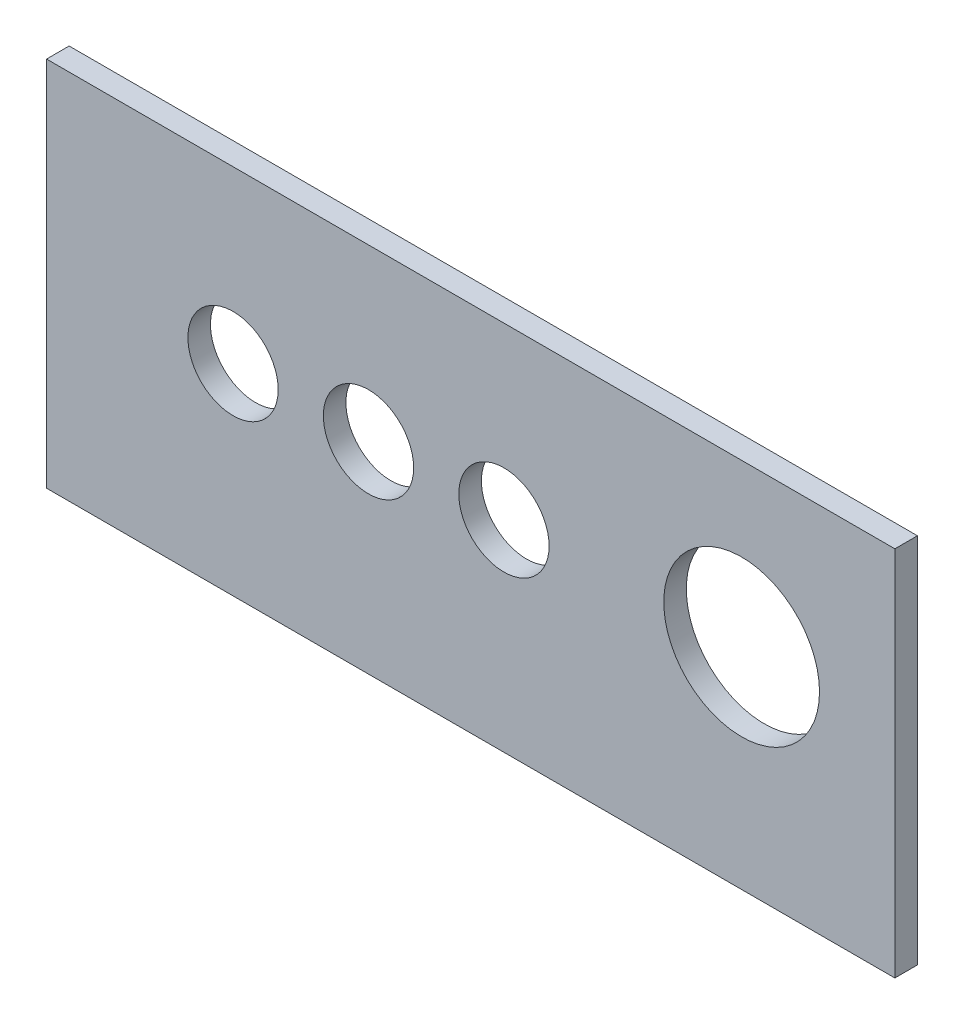
ISO-10303-21;
HEADER;
FILE_DESCRIPTION(('STEP AP214'),'2;1');
FILE_NAME('part.step','',(''),(''),'','','');
FILE_SCHEMA(('AUTOMOTIVE_DESIGN { 1 0 10303 214 1 1 1 1 }'));
ENDSEC;
DATA;
#1=APPLICATION_CONTEXT('core data for automotive mechanical design processes');
#2=APPLICATION_PROTOCOL_DEFINITION('international standard','automotive_design',2000,#1);
#3=PRODUCT_CONTEXT('',#1,'mechanical');
#4=PRODUCT('Part','Part','',(#3));
#5=PRODUCT_RELATED_PRODUCT_CATEGORY('part','',(#4));
#6=PRODUCT_DEFINITION_FORMATION('','',#4);
#7=PRODUCT_DEFINITION_CONTEXT('part definition',#1,'design');
#8=PRODUCT_DEFINITION('design','',#6,#7);
#9=PRODUCT_DEFINITION_SHAPE('','',#8);
#10=(LENGTH_UNIT() NAMED_UNIT(*) SI_UNIT(.MILLI.,.METRE.));
#11=(NAMED_UNIT(*) PLANE_ANGLE_UNIT() SI_UNIT($,.RADIAN.));
#12=(NAMED_UNIT(*) SI_UNIT($,.STERADIAN.) SOLID_ANGLE_UNIT());
#13=UNCERTAINTY_MEASURE_WITH_UNIT(LENGTH_MEASURE(1.E-05),#10,'distance_accuracy_value','');
#14=(GEOMETRIC_REPRESENTATION_CONTEXT(3) GLOBAL_UNCERTAINTY_ASSIGNED_CONTEXT((#13)) GLOBAL_UNIT_ASSIGNED_CONTEXT((#10,
#11,#12)) REPRESENTATION_CONTEXT('',''));
#15=CARTESIAN_POINT('',(0.,0.,0.));
#16=DIRECTION('',(0.,0.,1.));
#17=DIRECTION('',(1.,0.,0.));
#18=AXIS2_PLACEMENT_3D('',#15,#16,#17);
#19=CARTESIAN_POINT('',(0.,0.,12.7));
#20=DIRECTION('',(0.,0.,-1.));
#21=DIRECTION('',(-1.,0.,0.));
#22=AXIS2_PLACEMENT_3D('',#19,#20,#21);
#23=PLANE('',#22);
#24=DIRECTION('',(-1.,0.,0.));
#25=VECTOR('',#24,1.);
#26=CARTESIAN_POINT('',(7.20934195159046,216.99692709465,12.7));
#27=LINE('',#26,#25);
#28=CARTESIAN_POINT('',(484.398602740923,216.99692709465,12.7));
#29=VERTEX_POINT('',#28);
#30=CARTESIAN_POINT('',(7.20934195159046,216.99692709465,12.7));
#31=VERTEX_POINT('',#30);
#32=EDGE_CURVE('E84',#29,#31,#27,.T.);
#33=ORIENTED_EDGE('',*,*,#32,.T.);
#34=DIRECTION('',(0.,-1.,0.));
#35=VECTOR('',#34,1.);
#36=CARTESIAN_POINT('',(7.20934195159043,7.9019039756168,12.7));
#37=LINE('',#36,#35);
#38=CARTESIAN_POINT('',(7.20934195159043,7.9019039756168,12.7));
#39=VERTEX_POINT('',#38);
#40=EDGE_CURVE('E79',#31,#39,#37,.T.);
#41=ORIENTED_EDGE('',*,*,#40,.T.);
#42=DIRECTION('',(1.,0.,0.));
#43=VECTOR('',#42,1.);
#44=CARTESIAN_POINT('',(7.20934195159043,7.9019039756168,12.7));
#45=LINE('',#44,#43);
#46=CARTESIAN_POINT('',(484.398602740923,7.9019039756168,12.7));
#47=VERTEX_POINT('',#46);
#48=EDGE_CURVE('E82',#39,#47,#45,.T.);
#49=ORIENTED_EDGE('',*,*,#48,.T.);
#50=DIRECTION('',(0.,1.,0.));
#51=VECTOR('',#50,1.);
#52=CARTESIAN_POINT('',(484.398602740923,216.99692709465,12.7));
#53=LINE('',#52,#51);
#54=EDGE_CURVE('E49',#47,#29,#53,.T.);
#55=ORIENTED_EDGE('',*,*,#54,.T.);
#56=EDGE_LOOP('',(#33,#41,#49,#55));
#57=FACE_BOUND('',#56,.T.);
#58=CARTESIAN_POINT('',(264.498491904483,121.096908294048,12.7));
#59=DIRECTION('',(0.,0.,1.));
#60=DIRECTION('',(1.,0.,0.));
#61=AXIS2_PLACEMENT_3D('',#58,#59,#60);
#62=CIRCLE('',#61,25.3999999999999);
#63=CARTESIAN_POINT('',(289.898491904483,121.096908294048,12.7));
#64=VERTEX_POINT('',#63);
#65=EDGE_CURVE('E99',#64,#64,#62,.T.);
#66=ORIENTED_EDGE('',*,*,#65,.F.);
#67=EDGE_LOOP('',(#66));
#68=FACE_BOUND('',#67,.T.);
#69=CARTESIAN_POINT('',(188.298491904484,121.096908294048,12.7));
#70=DIRECTION('',(0.,0.,1.));
#71=DIRECTION('',(1.,0.,0.));
#72=AXIS2_PLACEMENT_3D('',#69,#70,#71);
#73=CIRCLE('',#72,25.4);
#74=CARTESIAN_POINT('',(213.698491904484,121.096908294048,12.7));
#75=VERTEX_POINT('',#74);
#76=EDGE_CURVE('E114',#75,#75,#73,.T.);
#77=ORIENTED_EDGE('',*,*,#76,.F.);
#78=EDGE_LOOP('',(#77));
#79=FACE_BOUND('',#78,.T.);
#80=CARTESIAN_POINT('',(112.098491904484,121.096908294047,12.7));
#81=DIRECTION('',(0.,0.,1.));
#82=DIRECTION('',(1.,0.,0.));
#83=AXIS2_PLACEMENT_3D('',#80,#81,#82);
#84=CIRCLE('',#83,25.4);
#85=CARTESIAN_POINT('',(137.498491904484,121.096908294047,12.7));
#86=VERTEX_POINT('',#85);
#87=EDGE_CURVE('E120',#86,#86,#84,.T.);
#88=ORIENTED_EDGE('',*,*,#87,.F.);
#89=EDGE_LOOP('',(#88));
#90=FACE_BOUND('',#89,.T.);
#91=CARTESIAN_POINT('',(398.203972346683,126.103389525668,12.7));
#92=DIRECTION('',(0.,0.,1.));
#93=DIRECTION('',(1.,0.,0.));
#94=AXIS2_PLACEMENT_3D('',#91,#92,#93);
#95=CIRCLE('',#94,43.815);
#96=CARTESIAN_POINT('',(442.018972346683,126.103389525668,12.7));
#97=VERTEX_POINT('',#96);
#98=EDGE_CURVE('E126',#97,#97,#95,.T.);
#99=ORIENTED_EDGE('',*,*,#98,.F.);
#100=EDGE_LOOP('',(#99));
#101=FACE_BOUND('',#100,.T.);
#102=ADVANCED_FACE('F32',(#57,#68,#79,#90,#101),#23,.F.);
#103=CARTESIAN_POINT('',(0.,0.,0.));
#104=DIRECTION('',(0.,0.,-1.));
#105=DIRECTION('',(-1.,0.,0.));
#106=AXIS2_PLACEMENT_3D('',#103,#104,#105);
#107=PLANE('',#106);
#108=CARTESIAN_POINT('',(112.098491904484,121.096908294047,0.));
#109=DIRECTION('',(0.,0.,1.));
#110=DIRECTION('',(1.,0.,0.));
#111=AXIS2_PLACEMENT_3D('',#108,#109,#110);
#112=CIRCLE('',#111,25.4);
#113=CARTESIAN_POINT('',(137.498491904484,121.096908294047,0.));
#114=VERTEX_POINT('',#113);
#115=EDGE_CURVE('E123',#114,#114,#112,.T.);
#116=ORIENTED_EDGE('',*,*,#115,.T.);
#117=EDGE_LOOP('',(#116));
#118=FACE_BOUND('',#117,.T.);
#119=CARTESIAN_POINT('',(264.498491904483,121.096908294048,0.));
#120=DIRECTION('',(0.,0.,1.));
#121=DIRECTION('',(1.,0.,0.));
#122=AXIS2_PLACEMENT_3D('',#119,#120,#121);
#123=CIRCLE('',#122,25.3999999999999);
#124=CARTESIAN_POINT('',(289.898491904483,121.096908294048,0.));
#125=VERTEX_POINT('',#124);
#126=EDGE_CURVE('E111',#125,#125,#123,.T.);
#127=ORIENTED_EDGE('',*,*,#126,.T.);
#128=EDGE_LOOP('',(#127));
#129=FACE_BOUND('',#128,.T.);
#130=DIRECTION('',(-1.,0.,0.));
#131=VECTOR('',#130,1.);
#132=CARTESIAN_POINT('',(7.20934195159046,216.99692709465,0.));
#133=LINE('',#132,#131);
#134=CARTESIAN_POINT('',(484.398602740923,216.99692709465,0.));
#135=VERTEX_POINT('',#134);
#136=CARTESIAN_POINT('',(7.20934195159046,216.99692709465,0.));
#137=VERTEX_POINT('',#136);
#138=EDGE_CURVE('E96',#135,#137,#133,.T.);
#139=ORIENTED_EDGE('',*,*,#138,.F.);
#140=DIRECTION('',(0.,1.,0.));
#141=VECTOR('',#140,1.);
#142=CARTESIAN_POINT('',(484.398602740923,216.99692709465,0.));
#143=LINE('',#142,#141);
#144=CARTESIAN_POINT('',(484.398602740923,7.9019039756168,0.));
#145=VERTEX_POINT('',#144);
#146=EDGE_CURVE('E72',#145,#135,#143,.T.);
#147=ORIENTED_EDGE('',*,*,#146,.F.);
#148=DIRECTION('',(1.,0.,0.));
#149=VECTOR('',#148,1.);
#150=CARTESIAN_POINT('',(7.20934195159043,7.9019039756168,0.));
#151=LINE('',#150,#149);
#152=CARTESIAN_POINT('',(7.20934195159043,7.9019039756168,0.));
#153=VERTEX_POINT('',#152);
#154=EDGE_CURVE('E66',#153,#145,#151,.T.);
#155=ORIENTED_EDGE('',*,*,#154,.F.);
#156=DIRECTION('',(0.,-1.,0.));
#157=VECTOR('',#156,1.);
#158=CARTESIAN_POINT('',(7.20934195159043,7.9019039756168,0.));
#159=LINE('',#158,#157);
#160=EDGE_CURVE('E88',#137,#153,#159,.T.);
#161=ORIENTED_EDGE('',*,*,#160,.F.);
#162=EDGE_LOOP('',(#139,#147,#155,#161));
#163=FACE_BOUND('',#162,.T.);
#164=CARTESIAN_POINT('',(188.298491904484,121.096908294048,0.));
#165=DIRECTION('',(0.,0.,1.));
#166=DIRECTION('',(1.,0.,0.));
#167=AXIS2_PLACEMENT_3D('',#164,#165,#166);
#168=CIRCLE('',#167,25.4);
#169=CARTESIAN_POINT('',(213.698491904484,121.096908294048,0.));
#170=VERTEX_POINT('',#169);
#171=EDGE_CURVE('E117',#170,#170,#168,.T.);
#172=ORIENTED_EDGE('',*,*,#171,.T.);
#173=EDGE_LOOP('',(#172));
#174=FACE_BOUND('',#173,.T.);
#175=CARTESIAN_POINT('',(398.203972346683,126.103389525668,0.));
#176=DIRECTION('',(0.,0.,1.));
#177=DIRECTION('',(1.,0.,0.));
#178=AXIS2_PLACEMENT_3D('',#175,#176,#177);
#179=CIRCLE('',#178,43.815);
#180=CARTESIAN_POINT('',(442.018972346683,126.103389525668,0.));
#181=VERTEX_POINT('',#180);
#182=EDGE_CURVE('E129',#181,#181,#179,.T.);
#183=ORIENTED_EDGE('',*,*,#182,.T.);
#184=EDGE_LOOP('',(#183));
#185=FACE_BOUND('',#184,.T.);
#186=ADVANCED_FACE('F107',(#118,#129,#163,#174,#185),#107,.T.);
#187=CARTESIAN_POINT('',(7.20934195159046,216.99692709465,12.7));
#188=DIRECTION('',(0.,-1.,0.));
#189=DIRECTION('',(0.,0.,-1.));
#190=AXIS2_PLACEMENT_3D('',#187,#188,#189);
#191=PLANE('',#190);
#192=ORIENTED_EDGE('',*,*,#138,.T.);
#193=DIRECTION('',(0.,0.,-1.));
#194=VECTOR('',#193,1.);
#195=CARTESIAN_POINT('',(7.20934195159046,216.99692709465,12.7));
#196=LINE('',#195,#194);
#197=EDGE_CURVE('E11',#31,#137,#196,.T.);
#198=ORIENTED_EDGE('',*,*,#197,.F.);
#199=ORIENTED_EDGE('',*,*,#32,.F.);
#200=DIRECTION('',(0.,0.,-1.));
#201=VECTOR('',#200,1.);
#202=CARTESIAN_POINT('',(484.398602740923,216.99692709465,12.7));
#203=LINE('',#202,#201);
#204=EDGE_CURVE('E92',#29,#135,#203,.T.);
#205=ORIENTED_EDGE('',*,*,#204,.T.);
#206=EDGE_LOOP('',(#192,#198,#199,#205));
#207=FACE_BOUND('',#206,.T.);
#208=ADVANCED_FACE('F34',(#207),#191,.F.);
#209=CARTESIAN_POINT('',(7.20934195159043,7.9019039756168,12.7));
#210=DIRECTION('',(1.,0.,0.));
#211=DIRECTION('',(0.,1.,0.));
#212=AXIS2_PLACEMENT_3D('',#209,#210,#211);
#213=PLANE('',#212);
#214=ORIENTED_EDGE('',*,*,#160,.T.);
#215=DIRECTION('',(0.,0.,-1.));
#216=VECTOR('',#215,1.);
#217=CARTESIAN_POINT('',(7.20934195159043,7.9019039756168,12.7));
#218=LINE('',#217,#216);
#219=EDGE_CURVE('E41',#39,#153,#218,.T.);
#220=ORIENTED_EDGE('',*,*,#219,.F.);
#221=ORIENTED_EDGE('',*,*,#40,.F.);
#222=ORIENTED_EDGE('',*,*,#197,.T.);
#223=EDGE_LOOP('',(#214,#220,#221,#222));
#224=FACE_BOUND('',#223,.T.);
#225=ADVANCED_FACE('F87',(#224),#213,.F.);
#226=CARTESIAN_POINT('',(7.20934195159043,7.9019039756168,12.7));
#227=DIRECTION('',(0.,1.,0.));
#228=DIRECTION('',(-1.,0.,0.));
#229=AXIS2_PLACEMENT_3D('',#226,#227,#228);
#230=PLANE('',#229);
#231=ORIENTED_EDGE('',*,*,#154,.T.);
#232=DIRECTION('',(0.,0.,-1.));
#233=VECTOR('',#232,1.);
#234=CARTESIAN_POINT('',(484.398602740923,7.9019039756168,12.7));
#235=LINE('',#234,#233);
#236=EDGE_CURVE('E89',#47,#145,#235,.T.);
#237=ORIENTED_EDGE('',*,*,#236,.F.);
#238=ORIENTED_EDGE('',*,*,#48,.F.);
#239=ORIENTED_EDGE('',*,*,#219,.T.);
#240=EDGE_LOOP('',(#231,#237,#238,#239));
#241=FACE_BOUND('',#240,.T.);
#242=ADVANCED_FACE('F90',(#241),#230,.F.);
#243=CARTESIAN_POINT('',(484.398602740923,216.99692709465,12.7));
#244=DIRECTION('',(-1.,0.,0.));
#245=DIRECTION('',(0.,-1.,0.));
#246=AXIS2_PLACEMENT_3D('',#243,#244,#245);
#247=PLANE('',#246);
#248=ORIENTED_EDGE('',*,*,#146,.T.);
#249=ORIENTED_EDGE('',*,*,#204,.F.);
#250=ORIENTED_EDGE('',*,*,#54,.F.);
#251=ORIENTED_EDGE('',*,*,#236,.T.);
#252=EDGE_LOOP('',(#248,#249,#250,#251));
#253=FACE_BOUND('',#252,.T.);
#254=ADVANCED_FACE('F104',(#253),#247,.F.);
#255=CARTESIAN_POINT('',(264.498491904483,121.096908294048,12.7));
#256=DIRECTION('',(0.,0.,-1.));
#257=DIRECTION('',(-1.,0.,0.));
#258=AXIS2_PLACEMENT_3D('',#255,#256,#257);
#259=CYLINDRICAL_SURFACE('',#258,25.3999999999999);
#260=ORIENTED_EDGE('',*,*,#126,.F.);
#261=EDGE_LOOP('',(#260));
#262=FACE_BOUND('',#261,.T.);
#263=ORIENTED_EDGE('',*,*,#65,.T.);
#264=EDGE_LOOP('',(#263));
#265=FACE_BOUND('',#264,.T.);
#266=ADVANCED_FACE('F145',(#262,#265),#259,.F.);
#267=CARTESIAN_POINT('',(188.298491904484,121.096908294048,12.7));
#268=DIRECTION('',(0.,0.,-1.));
#269=DIRECTION('',(-1.,0.,0.));
#270=AXIS2_PLACEMENT_3D('',#267,#268,#269);
#271=CYLINDRICAL_SURFACE('',#270,25.4);
#272=ORIENTED_EDGE('',*,*,#171,.F.);
#273=EDGE_LOOP('',(#272));
#274=FACE_BOUND('',#273,.T.);
#275=ORIENTED_EDGE('',*,*,#76,.T.);
#276=EDGE_LOOP('',(#275));
#277=FACE_BOUND('',#276,.T.);
#278=ADVANCED_FACE('F191',(#274,#277),#271,.F.);
#279=CARTESIAN_POINT('',(112.098491904484,121.096908294047,12.7));
#280=DIRECTION('',(0.,0.,-1.));
#281=DIRECTION('',(-1.,0.,0.));
#282=AXIS2_PLACEMENT_3D('',#279,#280,#281);
#283=CYLINDRICAL_SURFACE('',#282,25.4);
#284=ORIENTED_EDGE('',*,*,#115,.F.);
#285=EDGE_LOOP('',(#284));
#286=FACE_BOUND('',#285,.T.);
#287=ORIENTED_EDGE('',*,*,#87,.T.);
#288=EDGE_LOOP('',(#287));
#289=FACE_BOUND('',#288,.T.);
#290=ADVANCED_FACE('F202',(#286,#289),#283,.F.);
#291=CARTESIAN_POINT('',(398.203972346683,126.103389525668,12.7));
#292=DIRECTION('',(0.,0.,-1.));
#293=DIRECTION('',(-1.,0.,0.));
#294=AXIS2_PLACEMENT_3D('',#291,#292,#293);
#295=CYLINDRICAL_SURFACE('',#294,43.815);
#296=ORIENTED_EDGE('',*,*,#182,.F.);
#297=EDGE_LOOP('',(#296));
#298=FACE_BOUND('',#297,.T.);
#299=ORIENTED_EDGE('',*,*,#98,.T.);
#300=EDGE_LOOP('',(#299));
#301=FACE_BOUND('',#300,.T.);
#302=ADVANCED_FACE('F135',(#298,#301),#295,.F.);
#303=CLOSED_SHELL('',(#102,#186,#208,#225,#242,#254,#266,#278,#290,#302));
#304=MANIFOLD_SOLID_BREP('B2',#303);
#305=ADVANCED_BREP_SHAPE_REPRESENTATION('',(#18,#304),#14);
#306=SHAPE_DEFINITION_REPRESENTATION(#9,#305);
ENDSEC;
END-ISO-10303-21;
